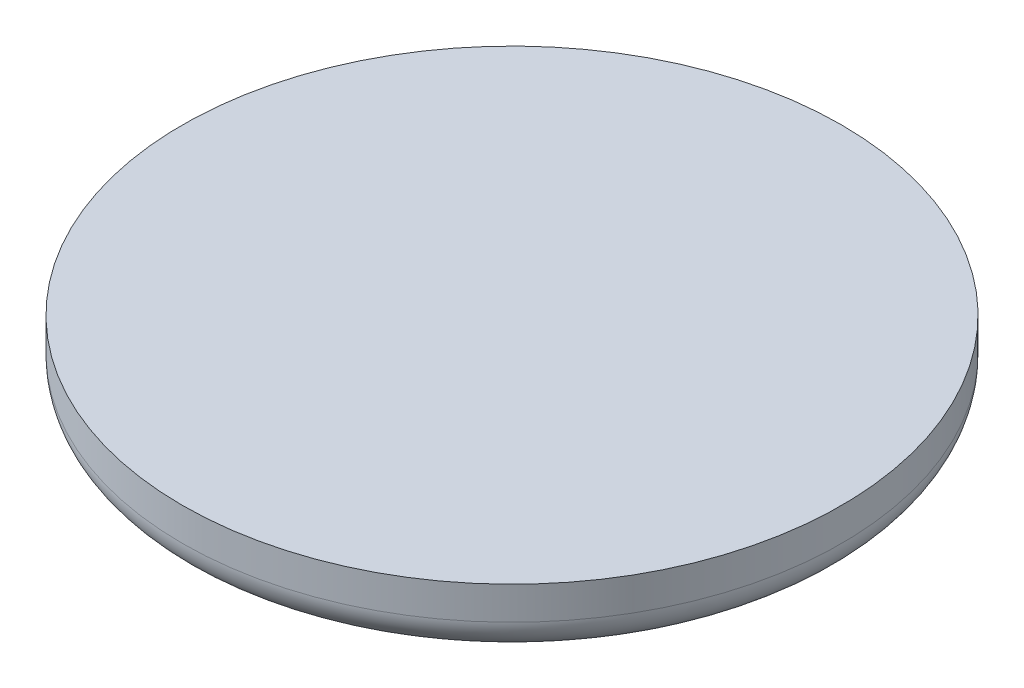
ISO-10303-21;
HEADER;
FILE_DESCRIPTION(('STEP AP214'),'2;1');
FILE_NAME('part.step','',(''),(''),'','','');
FILE_SCHEMA(('AUTOMOTIVE_DESIGN { 1 0 10303 214 1 1 1 1 }'));
ENDSEC;
DATA;
#1=APPLICATION_CONTEXT('core data for automotive mechanical design processes');
#2=APPLICATION_PROTOCOL_DEFINITION('international standard','automotive_design',2000,#1);
#3=PRODUCT_CONTEXT('',#1,'mechanical');
#4=PRODUCT('Part','Part','',(#3));
#5=PRODUCT_RELATED_PRODUCT_CATEGORY('part','',(#4));
#6=PRODUCT_DEFINITION_FORMATION('','',#4);
#7=PRODUCT_DEFINITION_CONTEXT('part definition',#1,'design');
#8=PRODUCT_DEFINITION('design','',#6,#7);
#9=PRODUCT_DEFINITION_SHAPE('','',#8);
#10=(LENGTH_UNIT() NAMED_UNIT(*) SI_UNIT(.MILLI.,.METRE.));
#11=(NAMED_UNIT(*) PLANE_ANGLE_UNIT() SI_UNIT($,.RADIAN.));
#12=(NAMED_UNIT(*) SI_UNIT($,.STERADIAN.) SOLID_ANGLE_UNIT());
#13=UNCERTAINTY_MEASURE_WITH_UNIT(LENGTH_MEASURE(1.E-05),#10,'distance_accuracy_value','');
#14=(GEOMETRIC_REPRESENTATION_CONTEXT(3) GLOBAL_UNCERTAINTY_ASSIGNED_CONTEXT((#13)) GLOBAL_UNIT_ASSIGNED_CONTEXT((#10,
#11,#12)) REPRESENTATION_CONTEXT('',''));
#15=CARTESIAN_POINT('',(0.,0.,0.));
#16=DIRECTION('',(0.,0.,1.));
#17=DIRECTION('',(1.,0.,0.));
#18=AXIS2_PLACEMENT_3D('',#15,#16,#17);
#19=CARTESIAN_POINT('',(0.,-3.,0.));
#20=DIRECTION('',(0.,1.,0.));
#21=DIRECTION('',(0.,0.,1.));
#22=AXIS2_PLACEMENT_3D('',#19,#20,#21);
#23=CYLINDRICAL_SURFACE('',#22,15.);
#24=CARTESIAN_POINT('',(0.,-1.5,0.));
#25=DIRECTION('',(0.,1.,0.));
#26=DIRECTION('',(0.,0.,1.));
#27=AXIS2_PLACEMENT_3D('',#24,#25,#26);
#28=CIRCLE('',#27,15.);
#29=CARTESIAN_POINT('',(0.,-1.5,15.));
#30=VERTEX_POINT('',#29);
#31=EDGE_CURVE('E44',#30,#30,#28,.T.);
#32=ORIENTED_EDGE('',*,*,#31,.T.);
#33=EDGE_LOOP('',(#32));
#34=FACE_BOUND('',#33,.T.);
#35=CARTESIAN_POINT('',(0.,0.,0.));
#36=DIRECTION('',(0.,1.,0.));
#37=DIRECTION('',(0.,0.,1.));
#38=AXIS2_PLACEMENT_3D('',#35,#36,#37);
#39=CIRCLE('',#38,15.);
#40=CARTESIAN_POINT('',(0.,0.,15.));
#41=VERTEX_POINT('',#40);
#42=EDGE_CURVE('E48',#41,#41,#39,.T.);
#43=ORIENTED_EDGE('',*,*,#42,.F.);
#44=EDGE_LOOP('',(#43));
#45=FACE_BOUND('',#44,.T.);
#46=ADVANCED_FACE('F37',(#34,#45),#23,.T.);
#47=CARTESIAN_POINT('',(0.,-3.,0.));
#48=DIRECTION('',(0.,1.,0.));
#49=DIRECTION('',(0.,0.,1.));
#50=AXIS2_PLACEMENT_3D('',#47,#48,#49);
#51=PLANE('',#50);
#52=CARTESIAN_POINT('',(0.,-3.,0.));
#53=DIRECTION('',(0.,1.,0.));
#54=DIRECTION('',(0.,0.,1.));
#55=AXIS2_PLACEMENT_3D('',#52,#53,#54);
#56=CIRCLE('',#55,13.5);
#57=CARTESIAN_POINT('',(0.,-3.,13.5));
#58=VERTEX_POINT('',#57);
#59=EDGE_CURVE('E10',#58,#58,#56,.F.);
#60=ORIENTED_EDGE('',*,*,#59,.T.);
#61=EDGE_LOOP('',(#60));
#62=FACE_BOUND('',#61,.T.);
#63=ADVANCED_FACE('F58',(#62),#51,.F.);
#64=CARTESIAN_POINT('',(0.,0.,0.));
#65=DIRECTION('',(0.,1.,0.));
#66=DIRECTION('',(0.,0.,1.));
#67=AXIS2_PLACEMENT_3D('',#64,#65,#66);
#68=PLANE('',#67);
#69=ORIENTED_EDGE('',*,*,#42,.T.);
#70=EDGE_LOOP('',(#69));
#71=FACE_BOUND('',#70,.T.);
#72=ADVANCED_FACE('F55',(#71),#68,.T.);
#73=CARTESIAN_POINT('',(0.,-1.5,0.));
#74=DIRECTION('',(0.,1.,0.));
#75=DIRECTION('',(0.,0.,1.));
#76=AXIS2_PLACEMENT_3D('',#73,#74,#75);
#77=TOROIDAL_SURFACE('',#76,13.5,1.5);
#78=ORIENTED_EDGE('',*,*,#59,.F.);
#79=EDGE_LOOP('',(#78));
#80=FACE_BOUND('',#79,.T.);
#81=ORIENTED_EDGE('',*,*,#31,.F.);
#82=EDGE_LOOP('',(#81));
#83=FACE_BOUND('',#82,.T.);
#84=ADVANCED_FACE('F39',(#80,#83),#77,.T.);
#85=CLOSED_SHELL('',(#46,#63,#72,#84));
#86=MANIFOLD_SOLID_BREP('B2',#85);
#87=ADVANCED_BREP_SHAPE_REPRESENTATION('',(#18,#86),#14);
#88=SHAPE_DEFINITION_REPRESENTATION(#9,#87);
ENDSEC;
END-ISO-10303-21;
